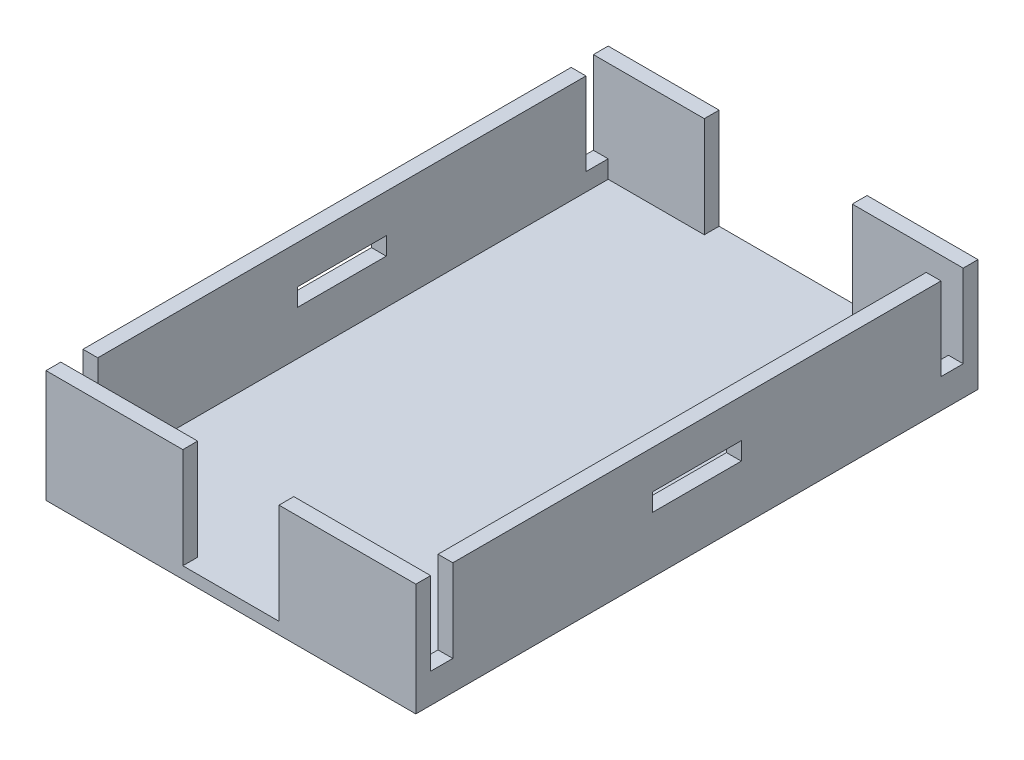
ISO-10303-21;
HEADER;
FILE_DESCRIPTION(('STEP AP214'),'2;1');
FILE_NAME('part.step','',(''),(''),'','','');
FILE_SCHEMA(('AUTOMOTIVE_DESIGN { 1 0 10303 214 1 1 1 1 }'));
ENDSEC;
DATA;
#1=APPLICATION_CONTEXT('core data for automotive mechanical design processes');
#2=APPLICATION_PROTOCOL_DEFINITION('international standard','automotive_design',2000,#1);
#3=PRODUCT_CONTEXT('',#1,'mechanical');
#4=PRODUCT('Part','Part','',(#3));
#5=PRODUCT_RELATED_PRODUCT_CATEGORY('part','',(#4));
#6=PRODUCT_DEFINITION_FORMATION('','',#4);
#7=PRODUCT_DEFINITION_CONTEXT('part definition',#1,'design');
#8=PRODUCT_DEFINITION('design','',#6,#7);
#9=PRODUCT_DEFINITION_SHAPE('','',#8);
#10=(LENGTH_UNIT() NAMED_UNIT(*) SI_UNIT(.MILLI.,.METRE.));
#11=(NAMED_UNIT(*) PLANE_ANGLE_UNIT() SI_UNIT($,.RADIAN.));
#12=(NAMED_UNIT(*) SI_UNIT($,.STERADIAN.) SOLID_ANGLE_UNIT());
#13=UNCERTAINTY_MEASURE_WITH_UNIT(LENGTH_MEASURE(1.E-05),#10,'distance_accuracy_value','');
#14=(GEOMETRIC_REPRESENTATION_CONTEXT(3) GLOBAL_UNCERTAINTY_ASSIGNED_CONTEXT((#13)) GLOBAL_UNIT_ASSIGNED_CONTEXT((#10,
#11,#12)) REPRESENTATION_CONTEXT('',''));
#15=CARTESIAN_POINT('',(0.,0.,0.));
#16=DIRECTION('',(0.,0.,1.));
#17=DIRECTION('',(1.,0.,0.));
#18=AXIS2_PLACEMENT_3D('',#15,#16,#17);
#19=CARTESIAN_POINT('',(0.,7.6,0.));
#20=DIRECTION('',(0.,-1.,0.));
#21=DIRECTION('',(0.,0.,-1.));
#22=AXIS2_PLACEMENT_3D('',#19,#20,#21);
#23=PLANE('',#22);
#24=DIRECTION('',(-1.,0.,0.));
#25=VECTOR('',#24,1.);
#26=CARTESIAN_POINT('',(-12.5,7.6,-19.));
#27=LINE('',#26,#25);
#28=CARTESIAN_POINT('',(12.5,7.6,-19.));
#29=VERTEX_POINT('',#28);
#30=CARTESIAN_POINT('',(5.,7.6,-19.));
#31=VERTEX_POINT('',#30);
#32=EDGE_CURVE('E350',#29,#31,#27,.T.);
#33=ORIENTED_EDGE('',*,*,#32,.T.);
#34=DIRECTION('',(0.,0.,-1.));
#35=VECTOR('',#34,1.);
#36=CARTESIAN_POINT('',(5.,7.6,-18.));
#37=LINE('',#36,#35);
#38=CARTESIAN_POINT('',(5.,7.6,-18.));
#39=VERTEX_POINT('',#38);
#40=EDGE_CURVE('E286',#39,#31,#37,.T.);
#41=ORIENTED_EDGE('',*,*,#40,.F.);
#42=DIRECTION('',(1.,0.,0.));
#43=VECTOR('',#42,1.);
#44=CARTESIAN_POINT('',(0.,7.6,-18.));
#45=LINE('',#44,#43);
#46=CARTESIAN_POINT('',(12.5,7.6,-18.));
#47=VERTEX_POINT('',#46);
#48=EDGE_CURVE('E319',#39,#47,#45,.T.);
#49=ORIENTED_EDGE('',*,*,#48,.T.);
#50=DIRECTION('',(0.,0.,-1.));
#51=VECTOR('',#50,1.);
#52=CARTESIAN_POINT('',(12.5,7.6,19.));
#53=LINE('',#52,#51);
#54=EDGE_CURVE('E349',#47,#29,#53,.T.);
#55=ORIENTED_EDGE('',*,*,#54,.T.);
#56=EDGE_LOOP('',(#33,#41,#49,#55));
#57=FACE_BOUND('',#56,.T.);
#58=ADVANCED_FACE('F45',(#57),#23,.F.);
#59=DIRECTION('',(1.,0.,0.));
#60=VECTOR('',#59,1.);
#61=CARTESIAN_POINT('',(0.,7.6,18.));
#62=LINE('',#61,#60);
#63=CARTESIAN_POINT('',(3.25,7.6,18.));
#64=VERTEX_POINT('',#63);
#65=CARTESIAN_POINT('',(12.5,7.6,18.));
#66=VERTEX_POINT('',#65);
#67=EDGE_CURVE('E291',#64,#66,#62,.T.);
#68=ORIENTED_EDGE('',*,*,#67,.F.);
#69=DIRECTION('',(0.,0.,-1.));
#70=VECTOR('',#69,1.);
#71=CARTESIAN_POINT('',(3.25,7.6,19.));
#72=LINE('',#71,#70);
#73=CARTESIAN_POINT('',(3.25,7.6,19.));
#74=VERTEX_POINT('',#73);
#75=EDGE_CURVE('E277',#74,#64,#72,.T.);
#76=ORIENTED_EDGE('',*,*,#75,.F.);
#77=DIRECTION('',(1.,0.,0.));
#78=VECTOR('',#77,1.);
#79=CARTESIAN_POINT('',(-12.5,7.6,19.));
#80=LINE('',#79,#78);
#81=CARTESIAN_POINT('',(12.5,7.6,19.));
#82=VERTEX_POINT('',#81);
#83=EDGE_CURVE('E359',#74,#82,#80,.T.);
#84=ORIENTED_EDGE('',*,*,#83,.T.);
#85=EDGE_CURVE('E301',#82,#66,#53,.T.);
#86=ORIENTED_EDGE('',*,*,#85,.T.);
#87=EDGE_LOOP('',(#68,#76,#84,#86));
#88=FACE_BOUND('',#87,.T.);
#89=ADVANCED_FACE('F299',(#88),#23,.F.);
#90=CARTESIAN_POINT('',(0.,0.8,18.));
#91=DIRECTION('',(0.,0.,1.));
#92=DIRECTION('',(1.,0.,0.));
#93=AXIS2_PLACEMENT_3D('',#90,#91,#92);
#94=PLANE('',#93);
#95=DIRECTION('',(1.,0.,0.));
#96=VECTOR('',#95,1.);
#97=CARTESIAN_POINT('',(0.,0.8,18.));
#98=LINE('',#97,#96);
#99=CARTESIAN_POINT('',(3.25,0.8,18.));
#100=VERTEX_POINT('',#99);
#101=CARTESIAN_POINT('',(11.5,0.8,18.));
#102=VERTEX_POINT('',#101);
#103=EDGE_CURVE('E294',#100,#102,#98,.T.);
#104=ORIENTED_EDGE('',*,*,#103,.F.);
#105=DIRECTION('',(0.,1.,0.));
#106=VECTOR('',#105,1.);
#107=CARTESIAN_POINT('',(3.25,-9.24987562112089,18.));
#108=LINE('',#107,#106);
#109=EDGE_CURVE('E69',#100,#64,#108,.T.);
#110=ORIENTED_EDGE('',*,*,#109,.T.);
#111=ORIENTED_EDGE('',*,*,#67,.T.);
#112=DIRECTION('',(0.,1.,0.));
#113=VECTOR('',#112,1.);
#114=CARTESIAN_POINT('',(12.5,2.,18.));
#115=LINE('',#114,#113);
#116=CARTESIAN_POINT('',(12.5,2.,18.));
#117=VERTEX_POINT('',#116);
#118=EDGE_CURVE('E466',#117,#66,#115,.T.);
#119=ORIENTED_EDGE('',*,*,#118,.F.);
#120=DIRECTION('',(1.,0.,0.));
#121=VECTOR('',#120,1.);
#122=CARTESIAN_POINT('',(0.,2.,18.));
#123=LINE('',#122,#121);
#124=CARTESIAN_POINT('',(11.5,2.,18.));
#125=VERTEX_POINT('',#124);
#126=EDGE_CURVE('E455',#125,#117,#123,.T.);
#127=ORIENTED_EDGE('',*,*,#126,.F.);
#128=DIRECTION('',(0.,1.,0.));
#129=VECTOR('',#128,1.);
#130=CARTESIAN_POINT('',(11.5,0.8,18.));
#131=LINE('',#130,#129);
#132=EDGE_CURVE('E341',#102,#125,#131,.T.);
#133=ORIENTED_EDGE('',*,*,#132,.F.);
#134=EDGE_LOOP('',(#104,#110,#111,#119,#127,#133));
#135=FACE_BOUND('',#134,.T.);
#136=ADVANCED_FACE('F290',(#135),#94,.F.);
#137=CARTESIAN_POINT('',(0.,0.8,-18.));
#138=DIRECTION('',(0.,0.,1.));
#139=DIRECTION('',(1.,0.,0.));
#140=AXIS2_PLACEMENT_3D('',#137,#138,#139);
#141=PLANE('',#140);
#142=DIRECTION('',(0.,1.,0.));
#143=VECTOR('',#142,1.);
#144=CARTESIAN_POINT('',(5.,-9.24987562112089,-18.));
#145=LINE('',#144,#143);
#146=CARTESIAN_POINT('',(5.,0.8,-18.));
#147=VERTEX_POINT('',#146);
#148=EDGE_CURVE('E584',#147,#39,#145,.T.);
#149=ORIENTED_EDGE('',*,*,#148,.F.);
#150=DIRECTION('',(1.,0.,0.));
#151=VECTOR('',#150,1.);
#152=CARTESIAN_POINT('',(0.,0.8,-18.));
#153=LINE('',#152,#151);
#154=CARTESIAN_POINT('',(11.5,0.8,-18.));
#155=VERTEX_POINT('',#154);
#156=EDGE_CURVE('E569',#147,#155,#153,.T.);
#157=ORIENTED_EDGE('',*,*,#156,.T.);
#158=DIRECTION('',(0.,1.,0.));
#159=VECTOR('',#158,1.);
#160=CARTESIAN_POINT('',(11.5,0.8,-18.));
#161=LINE('',#160,#159);
#162=CARTESIAN_POINT('',(11.5,2.,-18.));
#163=VERTEX_POINT('',#162);
#164=EDGE_CURVE('E337',#155,#163,#161,.T.);
#165=ORIENTED_EDGE('',*,*,#164,.T.);
#166=DIRECTION('',(1.,0.,0.));
#167=VECTOR('',#166,1.);
#168=CARTESIAN_POINT('',(0.,2.,-18.));
#169=LINE('',#168,#167);
#170=CARTESIAN_POINT('',(12.5,2.,-18.));
#171=VERTEX_POINT('',#170);
#172=EDGE_CURVE('E480',#163,#171,#169,.T.);
#173=ORIENTED_EDGE('',*,*,#172,.T.);
#174=DIRECTION('',(0.,1.,0.));
#175=VECTOR('',#174,1.);
#176=CARTESIAN_POINT('',(12.5,2.,-18.));
#177=LINE('',#176,#175);
#178=EDGE_CURVE('E500',#171,#47,#177,.T.);
#179=ORIENTED_EDGE('',*,*,#178,.T.);
#180=ORIENTED_EDGE('',*,*,#48,.F.);
#181=EDGE_LOOP('',(#149,#157,#165,#173,#179,#180));
#182=FACE_BOUND('',#181,.T.);
#183=ADVANCED_FACE('F582',(#182),#141,.T.);
#184=CARTESIAN_POINT('',(12.5,7.6,19.));
#185=DIRECTION('',(-1.,0.,0.));
#186=DIRECTION('',(0.,0.,1.));
#187=AXIS2_PLACEMENT_3D('',#184,#185,#186);
#188=PLANE('',#187);
#189=DIRECTION('',(0.,0.,1.));
#190=VECTOR('',#189,1.);
#191=CARTESIAN_POINT('',(12.5,5.,3.));
#192=LINE('',#191,#190);
#193=CARTESIAN_POINT('',(12.5,5.,-3.));
#194=VERTEX_POINT('',#193);
#195=CARTESIAN_POINT('',(12.5,5.,3.));
#196=VERTEX_POINT('',#195);
#197=EDGE_CURVE('E703',#194,#196,#192,.T.);
#198=ORIENTED_EDGE('',*,*,#197,.F.);
#199=DIRECTION('',(0.,1.,0.));
#200=VECTOR('',#199,1.);
#201=CARTESIAN_POINT('',(12.5,3.8,-3.));
#202=LINE('',#201,#200);
#203=CARTESIAN_POINT('',(12.5,3.8,-3.));
#204=VERTEX_POINT('',#203);
#205=EDGE_CURVE('E700',#204,#194,#202,.T.);
#206=ORIENTED_EDGE('',*,*,#205,.F.);
#207=DIRECTION('',(0.,0.,-1.));
#208=VECTOR('',#207,1.);
#209=CARTESIAN_POINT('',(12.5,3.8,3.));
#210=LINE('',#209,#208);
#211=CARTESIAN_POINT('',(12.5,3.8,3.));
#212=VERTEX_POINT('',#211);
#213=EDGE_CURVE('E709',#212,#204,#210,.T.);
#214=ORIENTED_EDGE('',*,*,#213,.F.);
#215=DIRECTION('',(0.,-1.,0.));
#216=VECTOR('',#215,1.);
#217=CARTESIAN_POINT('',(12.5,3.8,3.));
#218=LINE('',#217,#216);
#219=EDGE_CURVE('E417',#196,#212,#218,.T.);
#220=ORIENTED_EDGE('',*,*,#219,.F.);
#221=EDGE_LOOP('',(#198,#206,#214,#220));
#222=FACE_BOUND('',#221,.T.);
#223=ORIENTED_EDGE('',*,*,#178,.F.);
#224=DIRECTION('',(0.,0.,-1.));
#225=VECTOR('',#224,1.);
#226=CARTESIAN_POINT('',(12.5,2.,0.));
#227=LINE('',#226,#225);
#228=CARTESIAN_POINT('',(12.5,2.,-16.5));
#229=VERTEX_POINT('',#228);
#230=EDGE_CURVE('E492',#229,#171,#227,.T.);
#231=ORIENTED_EDGE('',*,*,#230,.F.);
#232=DIRECTION('',(0.,1.,0.));
#233=VECTOR('',#232,1.);
#234=CARTESIAN_POINT('',(12.5,2.,-16.5));
#235=LINE('',#234,#233);
#236=CARTESIAN_POINT('',(12.5,7.6,-16.5));
#237=VERTEX_POINT('',#236);
#238=EDGE_CURVE('E505',#229,#237,#235,.T.);
#239=ORIENTED_EDGE('',*,*,#238,.T.);
#240=CARTESIAN_POINT('',(12.5,7.6,16.5));
#241=VERTEX_POINT('',#240);
#242=EDGE_CURVE('E348',#241,#237,#53,.T.);
#243=ORIENTED_EDGE('',*,*,#242,.F.);
#244=DIRECTION('',(0.,1.,0.));
#245=VECTOR('',#244,1.);
#246=CARTESIAN_POINT('',(12.5,2.,16.5));
#247=LINE('',#246,#245);
#248=CARTESIAN_POINT('',(12.5,2.,16.5));
#249=VERTEX_POINT('',#248);
#250=EDGE_CURVE('E475',#249,#241,#247,.T.);
#251=ORIENTED_EDGE('',*,*,#250,.F.);
#252=DIRECTION('',(0.,0.,-1.));
#253=VECTOR('',#252,1.);
#254=CARTESIAN_POINT('',(12.5,2.,0.));
#255=LINE('',#254,#253);
#256=EDGE_CURVE('E459',#117,#249,#255,.T.);
#257=ORIENTED_EDGE('',*,*,#256,.F.);
#258=ORIENTED_EDGE('',*,*,#118,.T.);
#259=ORIENTED_EDGE('',*,*,#85,.F.);
#260=DIRECTION('',(0.,-1.,0.));
#261=VECTOR('',#260,1.);
#262=CARTESIAN_POINT('',(12.5,7.6,19.));
#263=LINE('',#262,#261);
#264=CARTESIAN_POINT('',(12.5,0.,19.));
#265=VERTEX_POINT('',#264);
#266=EDGE_CURVE('E365',#82,#265,#263,.T.);
#267=ORIENTED_EDGE('',*,*,#266,.T.);
#268=DIRECTION('',(0.,0.,-1.));
#269=VECTOR('',#268,1.);
#270=CARTESIAN_POINT('',(12.5,0.,19.));
#271=LINE('',#270,#269);
#272=CARTESIAN_POINT('',(12.5,0.,-19.));
#273=VERTEX_POINT('',#272);
#274=EDGE_CURVE('E332',#265,#273,#271,.T.);
#275=ORIENTED_EDGE('',*,*,#274,.T.);
#276=DIRECTION('',(0.,-1.,0.));
#277=VECTOR('',#276,1.);
#278=CARTESIAN_POINT('',(12.5,7.6,-19.));
#279=LINE('',#278,#277);
#280=EDGE_CURVE('E389',#29,#273,#279,.T.);
#281=ORIENTED_EDGE('',*,*,#280,.F.);
#282=ORIENTED_EDGE('',*,*,#54,.F.);
#283=EDGE_LOOP('',(#223,#231,#239,#243,#251,#257,#258,#259,#267,#275,#281,#282));
#284=FACE_BOUND('',#283,.T.);
#285=ADVANCED_FACE('F47',(#222,#284),#188,.F.);
#286=CARTESIAN_POINT('',(-12.5,7.6,19.));
#287=DIRECTION('',(1.,0.,0.));
#288=DIRECTION('',(0.,0.,-1.));
#289=AXIS2_PLACEMENT_3D('',#286,#287,#288);
#290=PLANE('',#289);
#291=DIRECTION('',(0.,0.,-1.));
#292=VECTOR('',#291,1.);
#293=CARTESIAN_POINT('',(-12.5,3.8,3.));
#294=LINE('',#293,#292);
#295=CARTESIAN_POINT('',(-12.5,3.8,3.));
#296=VERTEX_POINT('',#295);
#297=CARTESIAN_POINT('',(-12.5,3.8,-3.));
#298=VERTEX_POINT('',#297);
#299=EDGE_CURVE('E723',#296,#298,#294,.T.);
#300=ORIENTED_EDGE('',*,*,#299,.T.);
#301=DIRECTION('',(0.,1.,0.));
#302=VECTOR('',#301,1.);
#303=CARTESIAN_POINT('',(-12.5,3.8,-3.));
#304=LINE('',#303,#302);
#305=CARTESIAN_POINT('',(-12.5,5.,-3.));
#306=VERTEX_POINT('',#305);
#307=EDGE_CURVE('E712',#298,#306,#304,.T.);
#308=ORIENTED_EDGE('',*,*,#307,.T.);
#309=DIRECTION('',(0.,0.,1.));
#310=VECTOR('',#309,1.);
#311=CARTESIAN_POINT('',(-12.5,5.,3.));
#312=LINE('',#311,#310);
#313=CARTESIAN_POINT('',(-12.5,5.,3.));
#314=VERTEX_POINT('',#313);
#315=EDGE_CURVE('E716',#306,#314,#312,.T.);
#316=ORIENTED_EDGE('',*,*,#315,.T.);
#317=DIRECTION('',(0.,-1.,0.));
#318=VECTOR('',#317,1.);
#319=CARTESIAN_POINT('',(-12.5,3.8,3.));
#320=LINE('',#319,#318);
#321=EDGE_CURVE('E720',#314,#296,#320,.T.);
#322=ORIENTED_EDGE('',*,*,#321,.T.);
#323=EDGE_LOOP('',(#300,#308,#316,#322));
#324=FACE_BOUND('',#323,.T.);
#325=DIRECTION('',(0.,1.,0.));
#326=VECTOR('',#325,1.);
#327=CARTESIAN_POINT('',(-12.5,2.,18.));
#328=LINE('',#327,#326);
#329=CARTESIAN_POINT('',(-12.5,2.,18.));
#330=VERTEX_POINT('',#329);
#331=CARTESIAN_POINT('',(-12.5,7.6,18.));
#332=VERTEX_POINT('',#331);
#333=EDGE_CURVE('E499',#330,#332,#328,.T.);
#334=ORIENTED_EDGE('',*,*,#333,.F.);
#335=DIRECTION('',(0.,0.,1.));
#336=VECTOR('',#335,1.);
#337=CARTESIAN_POINT('',(-12.5,2.,0.));
#338=LINE('',#337,#336);
#339=CARTESIAN_POINT('',(-12.5,2.,16.5));
#340=VERTEX_POINT('',#339);
#341=EDGE_CURVE('E522',#340,#330,#338,.T.);
#342=ORIENTED_EDGE('',*,*,#341,.F.);
#343=DIRECTION('',(0.,1.,0.));
#344=VECTOR('',#343,1.);
#345=CARTESIAN_POINT('',(-12.5,2.,16.5));
#346=LINE('',#345,#344);
#347=CARTESIAN_POINT('',(-12.5,7.6,16.5));
#348=VERTEX_POINT('',#347);
#349=EDGE_CURVE('E532',#340,#348,#346,.T.);
#350=ORIENTED_EDGE('',*,*,#349,.T.);
#351=DIRECTION('',(0.,0.,1.));
#352=VECTOR('',#351,1.);
#353=CARTESIAN_POINT('',(-12.5,7.6,19.));
#354=LINE('',#353,#352);
#355=CARTESIAN_POINT('',(-12.5,7.6,-16.5));
#356=VERTEX_POINT('',#355);
#357=EDGE_CURVE('E360',#356,#348,#354,.T.);
#358=ORIENTED_EDGE('',*,*,#357,.F.);
#359=DIRECTION('',(0.,1.,0.));
#360=VECTOR('',#359,1.);
#361=CARTESIAN_POINT('',(-12.5,2.,-16.5));
#362=LINE('',#361,#360);
#363=CARTESIAN_POINT('',(-12.5,2.,-16.5));
#364=VERTEX_POINT('',#363);
#365=EDGE_CURVE('E304',#364,#356,#362,.T.);
#366=ORIENTED_EDGE('',*,*,#365,.F.);
#367=DIRECTION('',(0.,0.,1.));
#368=VECTOR('',#367,1.);
#369=CARTESIAN_POINT('',(-12.5,2.,0.));
#370=LINE('',#369,#368);
#371=CARTESIAN_POINT('',(-12.5,2.,-18.));
#372=VERTEX_POINT('',#371);
#373=EDGE_CURVE('E548',#372,#364,#370,.T.);
#374=ORIENTED_EDGE('',*,*,#373,.F.);
#375=DIRECTION('',(0.,1.,0.));
#376=VECTOR('',#375,1.);
#377=CARTESIAN_POINT('',(-12.5,2.,-18.));
#378=LINE('',#377,#376);
#379=CARTESIAN_POINT('',(-12.5,7.6,-18.));
#380=VERTEX_POINT('',#379);
#381=EDGE_CURVE('E310',#372,#380,#378,.T.);
#382=ORIENTED_EDGE('',*,*,#381,.T.);
#383=CARTESIAN_POINT('',(-12.5,7.6,-19.));
#384=VERTEX_POINT('',#383);
#385=EDGE_CURVE('E355',#384,#380,#354,.T.);
#386=ORIENTED_EDGE('',*,*,#385,.F.);
#387=DIRECTION('',(0.,-1.,0.));
#388=VECTOR('',#387,1.);
#389=CARTESIAN_POINT('',(-12.5,7.6,-19.));
#390=LINE('',#389,#388);
#391=CARTESIAN_POINT('',(-12.5,0.,-19.));
#392=VERTEX_POINT('',#391);
#393=EDGE_CURVE('E385',#384,#392,#390,.T.);
#394=ORIENTED_EDGE('',*,*,#393,.T.);
#395=DIRECTION('',(0.,0.,1.));
#396=VECTOR('',#395,1.);
#397=CARTESIAN_POINT('',(-12.5,0.,19.));
#398=LINE('',#397,#396);
#399=CARTESIAN_POINT('',(-12.5,0.,19.));
#400=VERTEX_POINT('',#399);
#401=EDGE_CURVE('E372',#392,#400,#398,.T.);
#402=ORIENTED_EDGE('',*,*,#401,.T.);
#403=DIRECTION('',(0.,-1.,0.));
#404=VECTOR('',#403,1.);
#405=CARTESIAN_POINT('',(-12.5,7.6,19.));
#406=LINE('',#405,#404);
#407=CARTESIAN_POINT('',(-12.5,7.6,19.));
#408=VERTEX_POINT('',#407);
#409=EDGE_CURVE('E381',#408,#400,#406,.T.);
#410=ORIENTED_EDGE('',*,*,#409,.F.);
#411=EDGE_CURVE('E354',#332,#408,#354,.T.);
#412=ORIENTED_EDGE('',*,*,#411,.F.);
#413=EDGE_LOOP('',(#334,#342,#350,#358,#366,#374,#382,#386,#394,#402,#410,#412));
#414=FACE_BOUND('',#413,.T.);
#415=ADVANCED_FACE('F633',(#324,#414),#290,.F.);
#416=CARTESIAN_POINT('',(-5.,7.6,-18.));
#417=VERTEX_POINT('',#416);
#418=EDGE_CURVE('E320',#380,#417,#45,.T.);
#419=ORIENTED_EDGE('',*,*,#418,.T.);
#420=DIRECTION('',(0.,0.,1.));
#421=VECTOR('',#420,1.);
#422=CARTESIAN_POINT('',(-5.,7.6,-18.));
#423=LINE('',#422,#421);
#424=CARTESIAN_POINT('',(-5.,7.6,-19.));
#425=VERTEX_POINT('',#424);
#426=EDGE_CURVE('E639',#425,#417,#423,.T.);
#427=ORIENTED_EDGE('',*,*,#426,.F.);
#428=EDGE_CURVE('E347',#425,#384,#27,.T.);
#429=ORIENTED_EDGE('',*,*,#428,.T.);
#430=ORIENTED_EDGE('',*,*,#385,.T.);
#431=EDGE_LOOP('',(#419,#427,#429,#430));
#432=FACE_BOUND('',#431,.T.);
#433=ADVANCED_FACE('F637',(#432),#23,.F.);
#434=CARTESIAN_POINT('',(-3.25,7.6,19.));
#435=VERTEX_POINT('',#434);
#436=EDGE_CURVE('E361',#408,#435,#80,.T.);
#437=ORIENTED_EDGE('',*,*,#436,.T.);
#438=DIRECTION('',(0.,0.,1.));
#439=VECTOR('',#438,1.);
#440=CARTESIAN_POINT('',(-3.25,7.6,19.));
#441=LINE('',#440,#439);
#442=CARTESIAN_POINT('',(-3.25,7.6,18.));
#443=VERTEX_POINT('',#442);
#444=EDGE_CURVE('E285',#443,#435,#441,.T.);
#445=ORIENTED_EDGE('',*,*,#444,.F.);
#446=EDGE_CURVE('E303',#332,#443,#62,.T.);
#447=ORIENTED_EDGE('',*,*,#446,.F.);
#448=ORIENTED_EDGE('',*,*,#411,.T.);
#449=EDGE_LOOP('',(#437,#445,#447,#448));
#450=FACE_BOUND('',#449,.T.);
#451=ADVANCED_FACE('F653',(#450),#23,.F.);
#452=ORIENTED_EDGE('',*,*,#242,.T.);
#453=DIRECTION('',(1.,0.,0.));
#454=VECTOR('',#453,1.);
#455=CARTESIAN_POINT('',(0.,7.6,-16.5));
#456=LINE('',#455,#454);
#457=CARTESIAN_POINT('',(11.5,7.6,-16.5));
#458=VERTEX_POINT('',#457);
#459=EDGE_CURVE('E484',#458,#237,#456,.T.);
#460=ORIENTED_EDGE('',*,*,#459,.F.);
#461=DIRECTION('',(0.,0.,-1.));
#462=VECTOR('',#461,1.);
#463=CARTESIAN_POINT('',(11.5,7.6,0.));
#464=LINE('',#463,#462);
#465=CARTESIAN_POINT('',(11.5,7.6,16.5));
#466=VERTEX_POINT('',#465);
#467=EDGE_CURVE('E309',#466,#458,#464,.T.);
#468=ORIENTED_EDGE('',*,*,#467,.F.);
#469=DIRECTION('',(1.,0.,0.));
#470=VECTOR('',#469,1.);
#471=CARTESIAN_POINT('',(0.,7.6,16.5));
#472=LINE('',#471,#470);
#473=EDGE_CURVE('E450',#466,#241,#472,.T.);
#474=ORIENTED_EDGE('',*,*,#473,.T.);
#475=EDGE_LOOP('',(#452,#460,#468,#474));
#476=FACE_BOUND('',#475,.T.);
#477=ADVANCED_FACE('F604',(#476),#23,.F.);
#478=ORIENTED_EDGE('',*,*,#357,.T.);
#479=DIRECTION('',(-1.,0.,0.));
#480=VECTOR('',#479,1.);
#481=CARTESIAN_POINT('',(0.,7.6,16.5));
#482=LINE('',#481,#480);
#483=CARTESIAN_POINT('',(-11.5,7.6,16.5));
#484=VERTEX_POINT('',#483);
#485=EDGE_CURVE('E474',#484,#348,#482,.T.);
#486=ORIENTED_EDGE('',*,*,#485,.F.);
#487=DIRECTION('',(0.,0.,-1.));
#488=VECTOR('',#487,1.);
#489=CARTESIAN_POINT('',(-11.5,7.6,0.));
#490=LINE('',#489,#488);
#491=CARTESIAN_POINT('',(-11.5,7.6,-16.5));
#492=VERTEX_POINT('',#491);
#493=EDGE_CURVE('E324',#484,#492,#490,.T.);
#494=ORIENTED_EDGE('',*,*,#493,.T.);
#495=DIRECTION('',(-1.,0.,0.));
#496=VECTOR('',#495,1.);
#497=CARTESIAN_POINT('',(0.,7.6,-16.5));
#498=LINE('',#497,#496);
#499=EDGE_CURVE('E504',#492,#356,#498,.T.);
#500=ORIENTED_EDGE('',*,*,#499,.T.);
#501=EDGE_LOOP('',(#478,#486,#494,#500));
#502=FACE_BOUND('',#501,.T.);
#503=ADVANCED_FACE('F667',(#502),#23,.F.);
#504=CARTESIAN_POINT('',(-11.5,0.8,0.));
#505=DIRECTION('',(1.,0.,0.));
#506=DIRECTION('',(0.,0.,-1.));
#507=AXIS2_PLACEMENT_3D('',#504,#505,#506);
#508=PLANE('',#507);
#509=DIRECTION('',(0.,1.,0.));
#510=VECTOR('',#509,1.);
#511=CARTESIAN_POINT('',(-11.5,0.8,-3.));
#512=LINE('',#511,#510);
#513=CARTESIAN_POINT('',(-11.5,3.8,-3.));
#514=VERTEX_POINT('',#513);
#515=CARTESIAN_POINT('',(-11.5,5.,-3.));
#516=VERTEX_POINT('',#515);
#517=EDGE_CURVE('E446',#514,#516,#512,.T.);
#518=ORIENTED_EDGE('',*,*,#517,.F.);
#519=DIRECTION('',(0.,0.,-1.));
#520=VECTOR('',#519,1.);
#521=CARTESIAN_POINT('',(-11.5,3.8,0.));
#522=LINE('',#521,#520);
#523=CARTESIAN_POINT('',(-11.5,3.8,3.));
#524=VERTEX_POINT('',#523);
#525=EDGE_CURVE('E443',#524,#514,#522,.T.);
#526=ORIENTED_EDGE('',*,*,#525,.F.);
#527=DIRECTION('',(0.,-1.,0.));
#528=VECTOR('',#527,1.);
#529=CARTESIAN_POINT('',(-11.5,0.799999999999999,3.));
#530=LINE('',#529,#528);
#531=CARTESIAN_POINT('',(-11.5,5.,3.));
#532=VERTEX_POINT('',#531);
#533=EDGE_CURVE('E440',#532,#524,#530,.T.);
#534=ORIENTED_EDGE('',*,*,#533,.F.);
#535=DIRECTION('',(0.,0.,1.));
#536=VECTOR('',#535,1.);
#537=CARTESIAN_POINT('',(-11.5,5.,0.));
#538=LINE('',#537,#536);
#539=EDGE_CURVE('E437',#516,#532,#538,.T.);
#540=ORIENTED_EDGE('',*,*,#539,.F.);
#541=EDGE_LOOP('',(#518,#526,#534,#540));
#542=FACE_BOUND('',#541,.T.);
#543=DIRECTION('',(0.,1.,0.));
#544=VECTOR('',#543,1.);
#545=CARTESIAN_POINT('',(-11.5,2.,16.5));
#546=LINE('',#545,#544);
#547=CARTESIAN_POINT('',(-11.5,2.,16.5));
#548=VERTEX_POINT('',#547);
#549=EDGE_CURVE('E526',#548,#484,#546,.T.);
#550=ORIENTED_EDGE('',*,*,#549,.F.);
#551=DIRECTION('',(0.,0.,-1.));
#552=VECTOR('',#551,1.);
#553=CARTESIAN_POINT('',(-11.5,2.,0.));
#554=LINE('',#553,#552);
#555=CARTESIAN_POINT('',(-11.5,2.,18.));
#556=VERTEX_POINT('',#555);
#557=EDGE_CURVE('E514',#556,#548,#554,.T.);
#558=ORIENTED_EDGE('',*,*,#557,.F.);
#559=DIRECTION('',(0.,1.,0.));
#560=VECTOR('',#559,1.);
#561=CARTESIAN_POINT('',(-11.5,0.8,18.));
#562=LINE('',#561,#560);
#563=CARTESIAN_POINT('',(-11.5,0.8,18.));
#564=VERTEX_POINT('',#563);
#565=EDGE_CURVE('E328',#564,#556,#562,.T.);
#566=ORIENTED_EDGE('',*,*,#565,.F.);
#567=DIRECTION('',(0.,0.,-1.));
#568=VECTOR('',#567,1.);
#569=CARTESIAN_POINT('',(-11.5,0.8,0.));
#570=LINE('',#569,#568);
#571=CARTESIAN_POINT('',(-11.5,0.8,-18.));
#572=VERTEX_POINT('',#571);
#573=EDGE_CURVE('E314',#564,#572,#570,.T.);
#574=ORIENTED_EDGE('',*,*,#573,.T.);
#575=DIRECTION('',(0.,1.,0.));
#576=VECTOR('',#575,1.);
#577=CARTESIAN_POINT('',(-11.5,0.8,-18.));
#578=LINE('',#577,#576);
#579=CARTESIAN_POINT('',(-11.5,2.,-18.));
#580=VERTEX_POINT('',#579);
#581=EDGE_CURVE('E333',#572,#580,#578,.T.);
#582=ORIENTED_EDGE('',*,*,#581,.T.);
#583=DIRECTION('',(0.,0.,-1.));
#584=VECTOR('',#583,1.);
#585=CARTESIAN_POINT('',(-11.5,2.,0.));
#586=LINE('',#585,#584);
#587=CARTESIAN_POINT('',(-11.5,2.,-16.5));
#588=VERTEX_POINT('',#587);
#589=EDGE_CURVE('E541',#588,#580,#586,.T.);
#590=ORIENTED_EDGE('',*,*,#589,.F.);
#591=DIRECTION('',(0.,1.,0.));
#592=VECTOR('',#591,1.);
#593=CARTESIAN_POINT('',(-11.5,2.,-16.5));
#594=LINE('',#593,#592);
#595=EDGE_CURVE('E552',#588,#492,#594,.T.);
#596=ORIENTED_EDGE('',*,*,#595,.T.);
#597=ORIENTED_EDGE('',*,*,#493,.F.);
#598=EDGE_LOOP('',(#550,#558,#566,#574,#582,#590,#596,#597));
#599=FACE_BOUND('',#598,.T.);
#600=ADVANCED_FACE('F675',(#542,#599),#508,.T.);
#601=CARTESIAN_POINT('',(11.5,0.8,0.));
#602=DIRECTION('',(1.,0.,0.));
#603=DIRECTION('',(0.,0.,-1.));
#604=AXIS2_PLACEMENT_3D('',#601,#602,#603);
#605=PLANE('',#604);
#606=DIRECTION('',(0.,0.,-1.));
#607=VECTOR('',#606,1.);
#608=CARTESIAN_POINT('',(11.5,3.8,0.));
#609=LINE('',#608,#607);
#610=CARTESIAN_POINT('',(11.5,3.8,3.));
#611=VERTEX_POINT('',#610);
#612=CARTESIAN_POINT('',(11.5,3.8,-3.));
#613=VERTEX_POINT('',#612);
#614=EDGE_CURVE('E54',#611,#613,#609,.T.);
#615=ORIENTED_EDGE('',*,*,#614,.T.);
#616=DIRECTION('',(0.,1.,0.));
#617=VECTOR('',#616,1.);
#618=CARTESIAN_POINT('',(11.5,0.8,-3.));
#619=LINE('',#618,#617);
#620=CARTESIAN_POINT('',(11.5,5.,-3.));
#621=VERTEX_POINT('',#620);
#622=EDGE_CURVE('E11',#613,#621,#619,.T.);
#623=ORIENTED_EDGE('',*,*,#622,.T.);
#624=DIRECTION('',(0.,0.,1.));
#625=VECTOR('',#624,1.);
#626=CARTESIAN_POINT('',(11.5,5.,0.));
#627=LINE('',#626,#625);
#628=CARTESIAN_POINT('',(11.5,5.,3.));
#629=VERTEX_POINT('',#628);
#630=EDGE_CURVE('E393',#621,#629,#627,.T.);
#631=ORIENTED_EDGE('',*,*,#630,.T.);
#632=DIRECTION('',(0.,-1.,0.));
#633=VECTOR('',#632,1.);
#634=CARTESIAN_POINT('',(11.5,0.799999999999999,3.));
#635=LINE('',#634,#633);
#636=EDGE_CURVE('E397',#629,#611,#635,.T.);
#637=ORIENTED_EDGE('',*,*,#636,.T.);
#638=EDGE_LOOP('',(#615,#623,#631,#637));
#639=FACE_BOUND('',#638,.T.);
#640=ORIENTED_EDGE('',*,*,#467,.T.);
#641=DIRECTION('',(0.,1.,0.));
#642=VECTOR('',#641,1.);
#643=CARTESIAN_POINT('',(11.5,2.,-16.5));
#644=LINE('',#643,#642);
#645=CARTESIAN_POINT('',(11.5,2.,-16.5));
#646=VERTEX_POINT('',#645);
#647=EDGE_CURVE('E496',#646,#458,#644,.T.);
#648=ORIENTED_EDGE('',*,*,#647,.F.);
#649=DIRECTION('',(0.,0.,-1.));
#650=VECTOR('',#649,1.);
#651=CARTESIAN_POINT('',(11.5,2.,0.));
#652=LINE('',#651,#650);
#653=EDGE_CURVE('E483',#646,#163,#652,.T.);
#654=ORIENTED_EDGE('',*,*,#653,.T.);
#655=ORIENTED_EDGE('',*,*,#164,.F.);
#656=DIRECTION('',(0.,0.,-1.));
#657=VECTOR('',#656,1.);
#658=CARTESIAN_POINT('',(11.5,0.8,0.));
#659=LINE('',#658,#657);
#660=EDGE_CURVE('E566',#102,#155,#659,.T.);
#661=ORIENTED_EDGE('',*,*,#660,.F.);
#662=ORIENTED_EDGE('',*,*,#132,.T.);
#663=DIRECTION('',(0.,0.,-1.));
#664=VECTOR('',#663,1.);
#665=CARTESIAN_POINT('',(11.5,2.,0.));
#666=LINE('',#665,#664);
#667=CARTESIAN_POINT('',(11.5,2.,16.5));
#668=VERTEX_POINT('',#667);
#669=EDGE_CURVE('E451',#125,#668,#666,.T.);
#670=ORIENTED_EDGE('',*,*,#669,.T.);
#671=DIRECTION('',(0.,1.,0.));
#672=VECTOR('',#671,1.);
#673=CARTESIAN_POINT('',(11.5,2.,16.5));
#674=LINE('',#673,#672);
#675=EDGE_CURVE('E470',#668,#466,#674,.T.);
#676=ORIENTED_EDGE('',*,*,#675,.T.);
#677=EDGE_LOOP('',(#640,#648,#654,#655,#661,#662,#670,#676));
#678=FACE_BOUND('',#677,.T.);
#679=ADVANCED_FACE('F403',(#639,#678),#605,.F.);
#680=CARTESIAN_POINT('',(-12.5,7.6,-19.));
#681=DIRECTION('',(0.,0.,1.));
#682=DIRECTION('',(1.,0.,0.));
#683=AXIS2_PLACEMENT_3D('',#680,#681,#682);
#684=PLANE('',#683);
#685=DIRECTION('',(1.,0.,0.));
#686=VECTOR('',#685,1.);
#687=CARTESIAN_POINT('',(-5.,0.8,-19.));
#688=LINE('',#687,#686);
#689=CARTESIAN_POINT('',(-5.,0.8,-19.));
#690=VERTEX_POINT('',#689);
#691=CARTESIAN_POINT('',(5.,0.8,-19.));
#692=VERTEX_POINT('',#691);
#693=EDGE_CURVE('E697',#690,#692,#688,.T.);
#694=ORIENTED_EDGE('',*,*,#693,.T.);
#695=DIRECTION('',(0.,1.,0.));
#696=VECTOR('',#695,1.);
#697=CARTESIAN_POINT('',(5.,-9.24987562112089,-19.));
#698=LINE('',#697,#696);
#699=EDGE_CURVE('E621',#692,#31,#698,.T.);
#700=ORIENTED_EDGE('',*,*,#699,.T.);
#701=ORIENTED_EDGE('',*,*,#32,.F.);
#702=ORIENTED_EDGE('',*,*,#280,.T.);
#703=DIRECTION('',(-1.,0.,0.));
#704=VECTOR('',#703,1.);
#705=CARTESIAN_POINT('',(-12.5,0.,-19.));
#706=LINE('',#705,#704);
#707=EDGE_CURVE('E369',#273,#392,#706,.T.);
#708=ORIENTED_EDGE('',*,*,#707,.T.);
#709=ORIENTED_EDGE('',*,*,#393,.F.);
#710=ORIENTED_EDGE('',*,*,#428,.F.);
#711=DIRECTION('',(0.,1.,0.));
#712=VECTOR('',#711,1.);
#713=CARTESIAN_POINT('',(-5.,-9.24987562112089,-19.));
#714=LINE('',#713,#712);
#715=EDGE_CURVE('E681',#690,#425,#714,.T.);
#716=ORIENTED_EDGE('',*,*,#715,.F.);
#717=EDGE_LOOP('',(#694,#700,#701,#702,#708,#709,#710,#716));
#718=FACE_BOUND('',#717,.T.);
#719=ADVANCED_FACE('F619',(#718),#684,.F.);
#720=CARTESIAN_POINT('',(-12.5,7.6,19.));
#721=DIRECTION('',(0.,0.,-1.));
#722=DIRECTION('',(-1.,0.,0.));
#723=AXIS2_PLACEMENT_3D('',#720,#721,#722);
#724=PLANE('',#723);
#725=ORIENTED_EDGE('',*,*,#83,.F.);
#726=DIRECTION('',(0.,1.,0.));
#727=VECTOR('',#726,1.);
#728=CARTESIAN_POINT('',(3.25,-9.24987562112089,19.));
#729=LINE('',#728,#727);
#730=CARTESIAN_POINT('',(3.25,0.8,19.));
#731=VERTEX_POINT('',#730);
#732=EDGE_CURVE('E280',#731,#74,#729,.T.);
#733=ORIENTED_EDGE('',*,*,#732,.F.);
#734=DIRECTION('',(-1.,0.,0.));
#735=VECTOR('',#734,1.);
#736=CARTESIAN_POINT('',(-3.25,0.8,19.));
#737=LINE('',#736,#735);
#738=CARTESIAN_POINT('',(-3.25,0.8,19.));
#739=VERTEX_POINT('',#738);
#740=EDGE_CURVE('E840',#731,#739,#737,.T.);
#741=ORIENTED_EDGE('',*,*,#740,.T.);
#742=DIRECTION('',(0.,1.,0.));
#743=VECTOR('',#742,1.);
#744=CARTESIAN_POINT('',(-3.25,-9.24987562112089,19.));
#745=LINE('',#744,#743);
#746=EDGE_CURVE('E837',#739,#435,#745,.T.);
#747=ORIENTED_EDGE('',*,*,#746,.T.);
#748=ORIENTED_EDGE('',*,*,#436,.F.);
#749=ORIENTED_EDGE('',*,*,#409,.T.);
#750=DIRECTION('',(1.,0.,0.));
#751=VECTOR('',#750,1.);
#752=CARTESIAN_POINT('',(-12.5,0.,19.));
#753=LINE('',#752,#751);
#754=EDGE_CURVE('E375',#400,#265,#753,.T.);
#755=ORIENTED_EDGE('',*,*,#754,.T.);
#756=ORIENTED_EDGE('',*,*,#266,.F.);
#757=EDGE_LOOP('',(#725,#733,#741,#747,#748,#749,#755,#756));
#758=FACE_BOUND('',#757,.T.);
#759=ADVANCED_FACE('F647',(#758),#724,.F.);
#760=CARTESIAN_POINT('',(0.,0.,0.));
#761=DIRECTION('',(0.,-1.,0.));
#762=DIRECTION('',(0.,0.,-1.));
#763=AXIS2_PLACEMENT_3D('',#760,#761,#762);
#764=PLANE('',#763);
#765=ORIENTED_EDGE('',*,*,#274,.F.);
#766=ORIENTED_EDGE('',*,*,#754,.F.);
#767=ORIENTED_EDGE('',*,*,#401,.F.);
#768=ORIENTED_EDGE('',*,*,#707,.F.);
#769=EDGE_LOOP('',(#765,#766,#767,#768));
#770=FACE_BOUND('',#769,.T.);
#771=ADVANCED_FACE('F626',(#770),#764,.T.);
#772=ORIENTED_EDGE('',*,*,#446,.T.);
#773=DIRECTION('',(0.,1.,0.));
#774=VECTOR('',#773,1.);
#775=CARTESIAN_POINT('',(-3.25,-9.24987562112089,18.));
#776=LINE('',#775,#774);
#777=CARTESIAN_POINT('',(-3.25,0.8,18.));
#778=VERTEX_POINT('',#777);
#779=EDGE_CURVE('E296',#778,#443,#776,.T.);
#780=ORIENTED_EDGE('',*,*,#779,.F.);
#781=EDGE_CURVE('E562',#564,#778,#98,.T.);
#782=ORIENTED_EDGE('',*,*,#781,.F.);
#783=ORIENTED_EDGE('',*,*,#565,.T.);
#784=DIRECTION('',(-1.,0.,0.));
#785=VECTOR('',#784,1.);
#786=CARTESIAN_POINT('',(0.,2.,18.));
#787=LINE('',#786,#785);
#788=EDGE_CURVE('E511',#556,#330,#787,.T.);
#789=ORIENTED_EDGE('',*,*,#788,.T.);
#790=ORIENTED_EDGE('',*,*,#333,.T.);
#791=EDGE_LOOP('',(#772,#780,#782,#783,#789,#790));
#792=FACE_BOUND('',#791,.T.);
#793=ADVANCED_FACE('F657',(#792),#94,.F.);
#794=DIRECTION('',(0.,1.,0.));
#795=VECTOR('',#794,1.);
#796=CARTESIAN_POINT('',(-5.,-9.24987562112089,-18.));
#797=LINE('',#796,#795);
#798=CARTESIAN_POINT('',(-5.,0.8,-18.));
#799=VERTEX_POINT('',#798);
#800=EDGE_CURVE('E61',#799,#417,#797,.T.);
#801=ORIENTED_EDGE('',*,*,#800,.T.);
#802=ORIENTED_EDGE('',*,*,#418,.F.);
#803=ORIENTED_EDGE('',*,*,#381,.F.);
#804=DIRECTION('',(-1.,0.,0.));
#805=VECTOR('',#804,1.);
#806=CARTESIAN_POINT('',(0.,2.,-18.));
#807=LINE('',#806,#805);
#808=EDGE_CURVE('E544',#580,#372,#807,.T.);
#809=ORIENTED_EDGE('',*,*,#808,.F.);
#810=ORIENTED_EDGE('',*,*,#581,.F.);
#811=EDGE_CURVE('E570',#572,#799,#153,.T.);
#812=ORIENTED_EDGE('',*,*,#811,.T.);
#813=EDGE_LOOP('',(#801,#802,#803,#809,#810,#812));
#814=FACE_BOUND('',#813,.T.);
#815=ADVANCED_FACE('F679',(#814),#141,.T.);
#816=CARTESIAN_POINT('',(0.,0.8,0.));
#817=DIRECTION('',(0.,1.,0.));
#818=DIRECTION('',(0.,0.,1.));
#819=AXIS2_PLACEMENT_3D('',#816,#817,#818);
#820=PLANE('',#819);
#821=ORIENTED_EDGE('',*,*,#781,.T.);
#822=DIRECTION('',(0.,0.,-1.));
#823=VECTOR('',#822,1.);
#824=CARTESIAN_POINT('',(-3.25,0.8,19.));
#825=LINE('',#824,#823);
#826=EDGE_CURVE('E836',#739,#778,#825,.T.);
#827=ORIENTED_EDGE('',*,*,#826,.F.);
#828=ORIENTED_EDGE('',*,*,#740,.F.);
#829=DIRECTION('',(0.,0.,1.));
#830=VECTOR('',#829,1.);
#831=CARTESIAN_POINT('',(3.25,0.8,19.));
#832=LINE('',#831,#830);
#833=EDGE_CURVE('E590',#100,#731,#832,.T.);
#834=ORIENTED_EDGE('',*,*,#833,.F.);
#835=ORIENTED_EDGE('',*,*,#103,.T.);
#836=ORIENTED_EDGE('',*,*,#660,.T.);
#837=ORIENTED_EDGE('',*,*,#156,.F.);
#838=DIRECTION('',(0.,0.,1.));
#839=VECTOR('',#838,1.);
#840=CARTESIAN_POINT('',(5.,0.8,-18.));
#841=LINE('',#840,#839);
#842=EDGE_CURVE('E694',#692,#147,#841,.T.);
#843=ORIENTED_EDGE('',*,*,#842,.F.);
#844=ORIENTED_EDGE('',*,*,#693,.F.);
#845=DIRECTION('',(0.,0.,-1.));
#846=VECTOR('',#845,1.);
#847=CARTESIAN_POINT('',(-5.,0.8,-18.));
#848=LINE('',#847,#846);
#849=EDGE_CURVE('E686',#799,#690,#848,.T.);
#850=ORIENTED_EDGE('',*,*,#849,.F.);
#851=ORIENTED_EDGE('',*,*,#811,.F.);
#852=ORIENTED_EDGE('',*,*,#573,.F.);
#853=EDGE_LOOP('',(#821,#827,#828,#834,#835,#836,#837,#843,#844,#850,#851,#852));
#854=FACE_BOUND('',#853,.T.);
#855=ADVANCED_FACE('F588',(#854),#820,.T.);
#856=CARTESIAN_POINT('',(0.,2.,16.5));
#857=DIRECTION('',(0.,0.,1.));
#858=DIRECTION('',(1.,0.,0.));
#859=AXIS2_PLACEMENT_3D('',#856,#857,#858);
#860=PLANE('',#859);
#861=ORIENTED_EDGE('',*,*,#473,.F.);
#862=ORIENTED_EDGE('',*,*,#675,.F.);
#863=DIRECTION('',(1.,0.,0.));
#864=VECTOR('',#863,1.);
#865=CARTESIAN_POINT('',(0.,2.,16.5));
#866=LINE('',#865,#864);
#867=EDGE_CURVE('E463',#668,#249,#866,.T.);
#868=ORIENTED_EDGE('',*,*,#867,.T.);
#869=ORIENTED_EDGE('',*,*,#250,.T.);
#870=EDGE_LOOP('',(#861,#862,#868,#869));
#871=FACE_BOUND('',#870,.T.);
#872=ADVANCED_FACE('F600',(#871),#860,.T.);
#873=CARTESIAN_POINT('',(0.,2.,0.));
#874=DIRECTION('',(0.,1.,0.));
#875=DIRECTION('',(0.,0.,1.));
#876=AXIS2_PLACEMENT_3D('',#873,#874,#875);
#877=PLANE('',#876);
#878=ORIENTED_EDGE('',*,*,#669,.F.);
#879=ORIENTED_EDGE('',*,*,#126,.T.);
#880=ORIENTED_EDGE('',*,*,#256,.T.);
#881=ORIENTED_EDGE('',*,*,#867,.F.);
#882=EDGE_LOOP('',(#878,#879,#880,#881));
#883=FACE_BOUND('',#882,.T.);
#884=ADVANCED_FACE('F596',(#883),#877,.T.);
#885=CARTESIAN_POINT('',(0.,2.,-16.5));
#886=DIRECTION('',(0.,0.,1.));
#887=DIRECTION('',(1.,0.,0.));
#888=AXIS2_PLACEMENT_3D('',#885,#886,#887);
#889=PLANE('',#888);
#890=ORIENTED_EDGE('',*,*,#459,.T.);
#891=ORIENTED_EDGE('',*,*,#238,.F.);
#892=DIRECTION('',(1.,0.,0.));
#893=VECTOR('',#892,1.);
#894=CARTESIAN_POINT('',(0.,2.,-16.5));
#895=LINE('',#894,#893);
#896=EDGE_CURVE('E488',#646,#229,#895,.T.);
#897=ORIENTED_EDGE('',*,*,#896,.F.);
#898=ORIENTED_EDGE('',*,*,#647,.T.);
#899=EDGE_LOOP('',(#890,#891,#897,#898));
#900=FACE_BOUND('',#899,.T.);
#901=ADVANCED_FACE('F802',(#900),#889,.F.);
#902=CARTESIAN_POINT('',(0.,2.,0.));
#903=DIRECTION('',(0.,1.,0.));
#904=DIRECTION('',(0.,0.,1.));
#905=AXIS2_PLACEMENT_3D('',#902,#903,#904);
#906=PLANE('',#905);
#907=ORIENTED_EDGE('',*,*,#172,.F.);
#908=ORIENTED_EDGE('',*,*,#653,.F.);
#909=ORIENTED_EDGE('',*,*,#896,.T.);
#910=ORIENTED_EDGE('',*,*,#230,.T.);
#911=EDGE_LOOP('',(#907,#908,#909,#910));
#912=FACE_BOUND('',#911,.T.);
#913=ADVANCED_FACE('F794',(#912),#906,.T.);
#914=CARTESIAN_POINT('',(0.,2.,-16.5));
#915=DIRECTION('',(0.,0.,-1.));
#916=DIRECTION('',(-1.,0.,0.));
#917=AXIS2_PLACEMENT_3D('',#914,#915,#916);
#918=PLANE('',#917);
#919=ORIENTED_EDGE('',*,*,#499,.F.);
#920=ORIENTED_EDGE('',*,*,#595,.F.);
#921=DIRECTION('',(-1.,0.,0.));
#922=VECTOR('',#921,1.);
#923=CARTESIAN_POINT('',(0.,2.,-16.5));
#924=LINE('',#923,#922);
#925=EDGE_CURVE('E538',#588,#364,#924,.T.);
#926=ORIENTED_EDGE('',*,*,#925,.T.);
#927=ORIENTED_EDGE('',*,*,#365,.T.);
#928=EDGE_LOOP('',(#919,#920,#926,#927));
#929=FACE_BOUND('',#928,.T.);
#930=ADVANCED_FACE('F670',(#929),#918,.T.);
#931=CARTESIAN_POINT('',(0.,2.,0.));
#932=DIRECTION('',(0.,1.,0.));
#933=DIRECTION('',(0.,0.,1.));
#934=AXIS2_PLACEMENT_3D('',#931,#932,#933);
#935=PLANE('',#934);
#936=ORIENTED_EDGE('',*,*,#925,.F.);
#937=ORIENTED_EDGE('',*,*,#589,.T.);
#938=ORIENTED_EDGE('',*,*,#808,.T.);
#939=ORIENTED_EDGE('',*,*,#373,.T.);
#940=EDGE_LOOP('',(#936,#937,#938,#939));
#941=FACE_BOUND('',#940,.T.);
#942=ADVANCED_FACE('F678',(#941),#935,.T.);
#943=CARTESIAN_POINT('',(0.,2.,16.5));
#944=DIRECTION('',(0.,0.,-1.));
#945=DIRECTION('',(-1.,0.,0.));
#946=AXIS2_PLACEMENT_3D('',#943,#944,#945);
#947=PLANE('',#946);
#948=ORIENTED_EDGE('',*,*,#485,.T.);
#949=ORIENTED_EDGE('',*,*,#349,.F.);
#950=DIRECTION('',(-1.,0.,0.));
#951=VECTOR('',#950,1.);
#952=CARTESIAN_POINT('',(0.,2.,16.5));
#953=LINE('',#952,#951);
#954=EDGE_CURVE('E518',#548,#340,#953,.T.);
#955=ORIENTED_EDGE('',*,*,#954,.F.);
#956=ORIENTED_EDGE('',*,*,#549,.T.);
#957=EDGE_LOOP('',(#948,#949,#955,#956));
#958=FACE_BOUND('',#957,.T.);
#959=ADVANCED_FACE('F797',(#958),#947,.F.);
#960=CARTESIAN_POINT('',(0.,2.,0.));
#961=DIRECTION('',(0.,1.,0.));
#962=DIRECTION('',(0.,0.,1.));
#963=AXIS2_PLACEMENT_3D('',#960,#961,#962);
#964=PLANE('',#963);
#965=ORIENTED_EDGE('',*,*,#788,.F.);
#966=ORIENTED_EDGE('',*,*,#557,.T.);
#967=ORIENTED_EDGE('',*,*,#954,.T.);
#968=ORIENTED_EDGE('',*,*,#341,.T.);
#969=EDGE_LOOP('',(#965,#966,#967,#968));
#970=FACE_BOUND('',#969,.T.);
#971=ADVANCED_FACE('F661',(#970),#964,.T.);
#972=CARTESIAN_POINT('',(-12.5,5.,3.));
#973=DIRECTION('',(0.,1.,0.));
#974=DIRECTION('',(0.,0.,1.));
#975=AXIS2_PLACEMENT_3D('',#972,#973,#974);
#976=PLANE('',#975);
#977=DIRECTION('',(1.,0.,0.));
#978=VECTOR('',#977,1.);
#979=CARTESIAN_POINT('',(-12.5,5.,-3.));
#980=LINE('',#979,#978);
#981=EDGE_CURVE('E436',#621,#194,#980,.T.);
#982=ORIENTED_EDGE('',*,*,#981,.T.);
#983=ORIENTED_EDGE('',*,*,#197,.T.);
#984=DIRECTION('',(1.,0.,0.));
#985=VECTOR('',#984,1.);
#986=CARTESIAN_POINT('',(-12.5,5.,3.));
#987=LINE('',#986,#985);
#988=EDGE_CURVE('E427',#629,#196,#987,.T.);
#989=ORIENTED_EDGE('',*,*,#988,.F.);
#990=ORIENTED_EDGE('',*,*,#630,.F.);
#991=EDGE_LOOP('',(#982,#983,#989,#990));
#992=FACE_BOUND('',#991,.T.);
#993=ADVANCED_FACE('F733',(#992),#976,.F.);
#994=CARTESIAN_POINT('',(-12.5,3.8,3.));
#995=DIRECTION('',(0.,0.,1.));
#996=DIRECTION('',(0.,-1.,0.));
#997=AXIS2_PLACEMENT_3D('',#994,#995,#996);
#998=PLANE('',#997);
#999=ORIENTED_EDGE('',*,*,#988,.T.);
#1000=ORIENTED_EDGE('',*,*,#219,.T.);
#1001=DIRECTION('',(1.,0.,0.));
#1002=VECTOR('',#1001,1.);
#1003=CARTESIAN_POINT('',(-12.5,3.8,3.));
#1004=LINE('',#1003,#1002);
#1005=EDGE_CURVE('E411',#611,#212,#1004,.T.);
#1006=ORIENTED_EDGE('',*,*,#1005,.F.);
#1007=ORIENTED_EDGE('',*,*,#636,.F.);
#1008=EDGE_LOOP('',(#999,#1000,#1006,#1007));
#1009=FACE_BOUND('',#1008,.T.);
#1010=ADVANCED_FACE('F415',(#1009),#998,.F.);
#1011=CARTESIAN_POINT('',(-12.5,3.8,3.));
#1012=DIRECTION('',(0.,-1.,0.));
#1013=DIRECTION('',(0.,0.,-1.));
#1014=AXIS2_PLACEMENT_3D('',#1011,#1012,#1013);
#1015=PLANE('',#1014);
#1016=ORIENTED_EDGE('',*,*,#1005,.T.);
#1017=ORIENTED_EDGE('',*,*,#213,.T.);
#1018=DIRECTION('',(1.,0.,0.));
#1019=VECTOR('',#1018,1.);
#1020=CARTESIAN_POINT('',(-12.5,3.8,-3.));
#1021=LINE('',#1020,#1019);
#1022=EDGE_CURVE('E413',#613,#204,#1021,.T.);
#1023=ORIENTED_EDGE('',*,*,#1022,.F.);
#1024=ORIENTED_EDGE('',*,*,#614,.F.);
#1025=EDGE_LOOP('',(#1016,#1017,#1023,#1024));
#1026=FACE_BOUND('',#1025,.T.);
#1027=ADVANCED_FACE('F409',(#1026),#1015,.F.);
#1028=CARTESIAN_POINT('',(-12.5,3.8,-3.));
#1029=DIRECTION('',(0.,0.,-1.));
#1030=DIRECTION('',(-1.,0.,0.));
#1031=AXIS2_PLACEMENT_3D('',#1028,#1029,#1030);
#1032=PLANE('',#1031);
#1033=ORIENTED_EDGE('',*,*,#1022,.T.);
#1034=ORIENTED_EDGE('',*,*,#205,.T.);
#1035=ORIENTED_EDGE('',*,*,#981,.F.);
#1036=ORIENTED_EDGE('',*,*,#622,.F.);
#1037=EDGE_LOOP('',(#1033,#1034,#1035,#1036));
#1038=FACE_BOUND('',#1037,.T.);
#1039=ADVANCED_FACE('F737',(#1038),#1032,.F.);
#1040=ORIENTED_EDGE('',*,*,#517,.T.);
#1041=EDGE_CURVE('E433',#306,#516,#980,.T.);
#1042=ORIENTED_EDGE('',*,*,#1041,.F.);
#1043=ORIENTED_EDGE('',*,*,#307,.F.);
#1044=EDGE_CURVE('E430',#298,#514,#1021,.T.);
#1045=ORIENTED_EDGE('',*,*,#1044,.T.);
#1046=EDGE_LOOP('',(#1040,#1042,#1043,#1045));
#1047=FACE_BOUND('',#1046,.T.);
#1048=ADVANCED_FACE('F744',(#1047),#1032,.F.);
#1049=ORIENTED_EDGE('',*,*,#525,.T.);
#1050=ORIENTED_EDGE('',*,*,#1044,.F.);
#1051=ORIENTED_EDGE('',*,*,#299,.F.);
#1052=EDGE_CURVE('E420',#296,#524,#1004,.T.);
#1053=ORIENTED_EDGE('',*,*,#1052,.T.);
#1054=EDGE_LOOP('',(#1049,#1050,#1051,#1053));
#1055=FACE_BOUND('',#1054,.T.);
#1056=ADVANCED_FACE('F815',(#1055),#1015,.F.);
#1057=ORIENTED_EDGE('',*,*,#533,.T.);
#1058=ORIENTED_EDGE('',*,*,#1052,.F.);
#1059=ORIENTED_EDGE('',*,*,#321,.F.);
#1060=EDGE_CURVE('E421',#314,#532,#987,.T.);
#1061=ORIENTED_EDGE('',*,*,#1060,.T.);
#1062=EDGE_LOOP('',(#1057,#1058,#1059,#1061));
#1063=FACE_BOUND('',#1062,.T.);
#1064=ADVANCED_FACE('F755',(#1063),#998,.F.);
#1065=ORIENTED_EDGE('',*,*,#539,.T.);
#1066=ORIENTED_EDGE('',*,*,#1060,.F.);
#1067=ORIENTED_EDGE('',*,*,#315,.F.);
#1068=ORIENTED_EDGE('',*,*,#1041,.T.);
#1069=EDGE_LOOP('',(#1065,#1066,#1067,#1068));
#1070=FACE_BOUND('',#1069,.T.);
#1071=ADVANCED_FACE('F752',(#1070),#976,.F.);
#1072=CARTESIAN_POINT('',(5.,-9.24987562112089,-18.));
#1073=DIRECTION('',(1.,0.,0.));
#1074=DIRECTION('',(0.,0.,-1.));
#1075=AXIS2_PLACEMENT_3D('',#1072,#1073,#1074);
#1076=PLANE('',#1075);
#1077=ORIENTED_EDGE('',*,*,#842,.T.);
#1078=ORIENTED_EDGE('',*,*,#148,.T.);
#1079=ORIENTED_EDGE('',*,*,#40,.T.);
#1080=ORIENTED_EDGE('',*,*,#699,.F.);
#1081=EDGE_LOOP('',(#1077,#1078,#1079,#1080));
#1082=FACE_BOUND('',#1081,.T.);
#1083=ADVANCED_FACE('F817',(#1082),#1076,.F.);
#1084=CARTESIAN_POINT('',(-5.,-9.24987562112089,-18.));
#1085=DIRECTION('',(-1.,0.,0.));
#1086=DIRECTION('',(0.,0.,1.));
#1087=AXIS2_PLACEMENT_3D('',#1084,#1085,#1086);
#1088=PLANE('',#1087);
#1089=ORIENTED_EDGE('',*,*,#849,.T.);
#1090=ORIENTED_EDGE('',*,*,#715,.T.);
#1091=ORIENTED_EDGE('',*,*,#426,.T.);
#1092=ORIENTED_EDGE('',*,*,#800,.F.);
#1093=EDGE_LOOP('',(#1089,#1090,#1091,#1092));
#1094=FACE_BOUND('',#1093,.T.);
#1095=ADVANCED_FACE('F822',(#1094),#1088,.F.);
#1096=CARTESIAN_POINT('',(3.25,-9.24987562112089,19.));
#1097=DIRECTION('',(1.,0.,0.));
#1098=DIRECTION('',(0.,0.,-1.));
#1099=AXIS2_PLACEMENT_3D('',#1096,#1097,#1098);
#1100=PLANE('',#1099);
#1101=ORIENTED_EDGE('',*,*,#833,.T.);
#1102=ORIENTED_EDGE('',*,*,#732,.T.);
#1103=ORIENTED_EDGE('',*,*,#75,.T.);
#1104=ORIENTED_EDGE('',*,*,#109,.F.);
#1105=EDGE_LOOP('',(#1101,#1102,#1103,#1104));
#1106=FACE_BOUND('',#1105,.T.);
#1107=ADVANCED_FACE('F278',(#1106),#1100,.F.);
#1108=CARTESIAN_POINT('',(-3.25,-9.24987562112089,19.));
#1109=DIRECTION('',(-1.,0.,0.));
#1110=DIRECTION('',(0.,0.,1.));
#1111=AXIS2_PLACEMENT_3D('',#1108,#1109,#1110);
#1112=PLANE('',#1111);
#1113=ORIENTED_EDGE('',*,*,#826,.T.);
#1114=ORIENTED_EDGE('',*,*,#779,.T.);
#1115=ORIENTED_EDGE('',*,*,#444,.T.);
#1116=ORIENTED_EDGE('',*,*,#746,.F.);
#1117=EDGE_LOOP('',(#1113,#1114,#1115,#1116));
#1118=FACE_BOUND('',#1117,.T.);
#1119=ADVANCED_FACE('F830',(#1118),#1112,.F.);
#1120=CLOSED_SHELL('',(#58,#89,#136,#183,#285,#415,#433,#451,#477,#503,#600,#679,#719,#759,#771,
#793,#815,#855,#872,#884,#901,#913,#930,#942,#959,#971,#993,#1010,#1027,#1039,#1048,#1056,#1064,
#1071,#1083,#1095,#1107,#1119));
#1121=MANIFOLD_SOLID_BREP('B2',#1120);
#1122=ADVANCED_BREP_SHAPE_REPRESENTATION('',(#18,#1121),#14);
#1123=SHAPE_DEFINITION_REPRESENTATION(#9,#1122);
ENDSEC;
END-ISO-10303-21;
